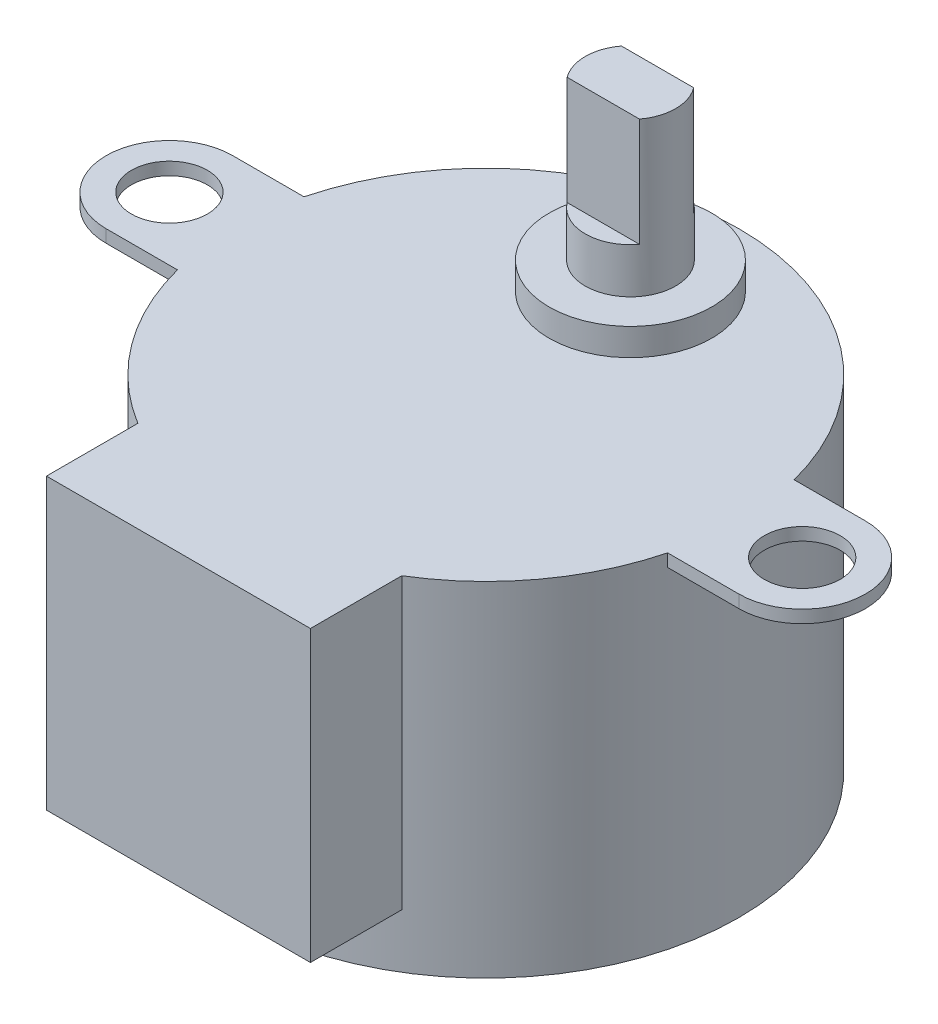
ISO-10303-21;
HEADER;
FILE_DESCRIPTION(('STEP AP214'),'2;1');
FILE_NAME('part.step','',(''),(''),'','','');
FILE_SCHEMA(('AUTOMOTIVE_DESIGN { 1 0 10303 214 1 1 1 1 }'));
ENDSEC;
DATA;
#1=APPLICATION_CONTEXT('core data for automotive mechanical design processes');
#2=APPLICATION_PROTOCOL_DEFINITION('international standard','automotive_design',2000,#1);
#3=PRODUCT_CONTEXT('',#1,'mechanical');
#4=PRODUCT('Part','Part','',(#3));
#5=PRODUCT_RELATED_PRODUCT_CATEGORY('part','',(#4));
#6=PRODUCT_DEFINITION_FORMATION('','',#4);
#7=PRODUCT_DEFINITION_CONTEXT('part definition',#1,'design');
#8=PRODUCT_DEFINITION('design','',#6,#7);
#9=PRODUCT_DEFINITION_SHAPE('','',#8);
#10=(LENGTH_UNIT() NAMED_UNIT(*) SI_UNIT(.MILLI.,.METRE.));
#11=(NAMED_UNIT(*) PLANE_ANGLE_UNIT() SI_UNIT($,.RADIAN.));
#12=(NAMED_UNIT(*) SI_UNIT($,.STERADIAN.) SOLID_ANGLE_UNIT());
#13=UNCERTAINTY_MEASURE_WITH_UNIT(LENGTH_MEASURE(1.E-05),#10,'distance_accuracy_value','');
#14=(GEOMETRIC_REPRESENTATION_CONTEXT(3) GLOBAL_UNCERTAINTY_ASSIGNED_CONTEXT((#13)) GLOBAL_UNIT_ASSIGNED_CONTEXT((#10,
#11,#12)) REPRESENTATION_CONTEXT('',''));
#15=CARTESIAN_POINT('',(0.,0.,0.));
#16=DIRECTION('',(0.,0.,1.));
#17=DIRECTION('',(1.,0.,0.));
#18=AXIS2_PLACEMENT_3D('',#15,#16,#17);
#19=CARTESIAN_POINT('',(0.,19.,0.));
#20=DIRECTION('',(0.,-1.,0.));
#21=DIRECTION('',(0.,0.,-1.));
#22=AXIS2_PLACEMENT_3D('',#19,#20,#21);
#23=CYLINDRICAL_SURFACE('',#22,14.);
#24=CARTESIAN_POINT('',(0.,19.,0.));
#25=DIRECTION('',(0.,1.,0.));
#26=DIRECTION('',(0.,0.,1.));
#27=AXIS2_PLACEMENT_3D('',#24,#25,#26);
#28=CIRCLE('',#27,14.);
#29=CARTESIAN_POINT('',(7.3,19.,11.9461290801665));
#30=VERTEX_POINT('',#29);
#31=CARTESIAN_POINT('',(13.555441711726,19.,3.5));
#32=VERTEX_POINT('',#31);
#33=EDGE_CURVE('E291',#30,#32,#28,.T.);
#34=ORIENTED_EDGE('',*,*,#33,.F.);
#35=DIRECTION('',(0.,1.,0.));
#36=VECTOR('',#35,1.);
#37=CARTESIAN_POINT('',(7.3,3.,11.9461290801665));
#38=LINE('',#37,#36);
#39=CARTESIAN_POINT('',(7.3,3.,11.9461290801665));
#40=VERTEX_POINT('',#39);
#41=EDGE_CURVE('E212',#40,#30,#38,.T.);
#42=ORIENTED_EDGE('',*,*,#41,.F.);
#43=CARTESIAN_POINT('',(0.,3.,0.));
#44=DIRECTION('',(0.,-1.,0.));
#45=DIRECTION('',(0.,0.,1.));
#46=AXIS2_PLACEMENT_3D('',#43,#44,#45);
#47=CIRCLE('',#46,14.);
#48=CARTESIAN_POINT('',(-7.3,3.,11.9461290801665));
#49=VERTEX_POINT('',#48);
#50=EDGE_CURVE('E192',#40,#49,#47,.T.);
#51=ORIENTED_EDGE('',*,*,#50,.T.);
#52=DIRECTION('',(0.,1.,0.));
#53=VECTOR('',#52,1.);
#54=CARTESIAN_POINT('',(-7.3,3.,11.9461290801665));
#55=LINE('',#54,#53);
#56=CARTESIAN_POINT('',(-7.3,19.,11.9461290801665));
#57=VERTEX_POINT('',#56);
#58=EDGE_CURVE('E205',#49,#57,#55,.T.);
#59=ORIENTED_EDGE('',*,*,#58,.T.);
#60=CARTESIAN_POINT('',(-13.555441711726,19.,3.5));
#61=VERTEX_POINT('',#60);
#62=EDGE_CURVE('E290',#61,#57,#28,.T.);
#63=ORIENTED_EDGE('',*,*,#62,.F.);
#64=DIRECTION('',(0.,1.,0.));
#65=VECTOR('',#64,1.);
#66=CARTESIAN_POINT('',(-13.555441711726,18.3,3.5));
#67=LINE('',#66,#65);
#68=CARTESIAN_POINT('',(-13.555441711726,18.3,3.5));
#69=VERTEX_POINT('',#68);
#70=EDGE_CURVE('E252',#69,#61,#67,.T.);
#71=ORIENTED_EDGE('',*,*,#70,.F.);
#72=CARTESIAN_POINT('',(0.,18.3,0.));
#73=DIRECTION('',(0.,1.,0.));
#74=DIRECTION('',(0.,0.,1.));
#75=AXIS2_PLACEMENT_3D('',#72,#73,#74);
#76=CIRCLE('',#75,14.);
#77=CARTESIAN_POINT('',(-13.555441711726,18.3,-3.5));
#78=VERTEX_POINT('',#77);
#79=EDGE_CURVE('E229',#78,#69,#76,.T.);
#80=ORIENTED_EDGE('',*,*,#79,.F.);
#81=DIRECTION('',(0.,1.,0.));
#82=VECTOR('',#81,1.);
#83=CARTESIAN_POINT('',(-13.555441711726,18.3,-3.5));
#84=LINE('',#83,#82);
#85=CARTESIAN_POINT('',(-13.555441711726,19.,-3.5));
#86=VERTEX_POINT('',#85);
#87=EDGE_CURVE('E249',#78,#86,#84,.T.);
#88=ORIENTED_EDGE('',*,*,#87,.T.);
#89=CARTESIAN_POINT('',(13.555441711726,19.,-3.5));
#90=VERTEX_POINT('',#89);
#91=EDGE_CURVE('E44',#90,#86,#28,.T.);
#92=ORIENTED_EDGE('',*,*,#91,.F.);
#93=DIRECTION('',(0.,1.,0.));
#94=VECTOR('',#93,1.);
#95=CARTESIAN_POINT('',(13.555441711726,18.3,-3.5));
#96=LINE('',#95,#94);
#97=CARTESIAN_POINT('',(13.555441711726,18.3,-3.5));
#98=VERTEX_POINT('',#97);
#99=EDGE_CURVE('E285',#98,#90,#96,.T.);
#100=ORIENTED_EDGE('',*,*,#99,.F.);
#101=CARTESIAN_POINT('',(0.,18.3,0.));
#102=DIRECTION('',(0.,1.,0.));
#103=DIRECTION('',(0.,0.,1.));
#104=AXIS2_PLACEMENT_3D('',#101,#102,#103);
#105=CIRCLE('',#104,14.);
#106=CARTESIAN_POINT('',(13.555441711726,18.3,3.5));
#107=VERTEX_POINT('',#106);
#108=EDGE_CURVE('E268',#107,#98,#105,.T.);
#109=ORIENTED_EDGE('',*,*,#108,.F.);
#110=DIRECTION('',(0.,1.,0.));
#111=VECTOR('',#110,1.);
#112=CARTESIAN_POINT('',(13.555441711726,18.3,3.5));
#113=LINE('',#112,#111);
#114=EDGE_CURVE('E282',#107,#32,#113,.T.);
#115=ORIENTED_EDGE('',*,*,#114,.T.);
#116=EDGE_LOOP('',(#34,#42,#51,#59,#63,#71,#80,#88,#92,#100,#109,#115));
#117=FACE_BOUND('',#116,.T.);
#118=CARTESIAN_POINT('',(0.,0.,0.));
#119=DIRECTION('',(0.,1.,0.));
#120=DIRECTION('',(0.,0.,1.));
#121=AXIS2_PLACEMENT_3D('',#118,#119,#120);
#122=CIRCLE('',#121,14.);
#123=CARTESIAN_POINT('',(0.,0.,14.));
#124=VERTEX_POINT('',#123);
#125=EDGE_CURVE('E39',#124,#124,#122,.T.);
#126=ORIENTED_EDGE('',*,*,#125,.T.);
#127=EDGE_LOOP('',(#126));
#128=FACE_BOUND('',#127,.T.);
#129=ADVANCED_FACE('F36',(#117,#128),#23,.T.);
#130=CARTESIAN_POINT('',(0.,19.,0.));
#131=DIRECTION('',(0.,1.,0.));
#132=DIRECTION('',(0.,0.,1.));
#133=AXIS2_PLACEMENT_3D('',#130,#131,#132);
#134=PLANE('',#133);
#135=CARTESIAN_POINT('',(0.,19.,-8.));
#136=DIRECTION('',(0.,1.,0.));
#137=DIRECTION('',(0.,0.,1.));
#138=AXIS2_PLACEMENT_3D('',#135,#136,#137);
#139=CIRCLE('',#138,4.5);
#140=CARTESIAN_POINT('',(0.,19.,-3.5));
#141=VERTEX_POINT('',#140);
#142=EDGE_CURVE('E184',#141,#141,#139,.T.);
#143=ORIENTED_EDGE('',*,*,#142,.F.);
#144=EDGE_LOOP('',(#143));
#145=FACE_BOUND('',#144,.T.);
#146=ORIENTED_EDGE('',*,*,#91,.T.);
#147=DIRECTION('',(1.,0.,0.));
#148=VECTOR('',#147,1.);
#149=CARTESIAN_POINT('',(0.,19.,-3.5));
#150=LINE('',#149,#148);
#151=CARTESIAN_POINT('',(-17.5,19.,-3.5));
#152=VERTEX_POINT('',#151);
#153=EDGE_CURVE('E241',#152,#86,#150,.T.);
#154=ORIENTED_EDGE('',*,*,#153,.F.);
#155=CARTESIAN_POINT('',(-17.5,19.,0.));
#156=DIRECTION('',(0.,1.,0.));
#157=DIRECTION('',(0.,0.,1.));
#158=AXIS2_PLACEMENT_3D('',#155,#156,#157);
#159=CIRCLE('',#158,3.5);
#160=CARTESIAN_POINT('',(-17.5,19.,3.5));
#161=VERTEX_POINT('',#160);
#162=EDGE_CURVE('E215',#161,#152,#159,.F.);
#163=ORIENTED_EDGE('',*,*,#162,.F.);
#164=DIRECTION('',(1.,0.,0.));
#165=VECTOR('',#164,1.);
#166=CARTESIAN_POINT('',(0.,19.,3.5));
#167=LINE('',#166,#165);
#168=EDGE_CURVE('E239',#161,#61,#167,.T.);
#169=ORIENTED_EDGE('',*,*,#168,.T.);
#170=ORIENTED_EDGE('',*,*,#62,.T.);
#171=DIRECTION('',(0.,0.,1.));
#172=VECTOR('',#171,1.);
#173=CARTESIAN_POINT('',(-7.3,19.,11.9461290801665));
#174=LINE('',#173,#172);
#175=CARTESIAN_POINT('',(-7.3,19.,17.));
#176=VERTEX_POINT('',#175);
#177=EDGE_CURVE('E189',#57,#176,#174,.T.);
#178=ORIENTED_EDGE('',*,*,#177,.T.);
#179=DIRECTION('',(1.,0.,0.));
#180=VECTOR('',#179,1.);
#181=CARTESIAN_POINT('',(-7.3,19.,17.));
#182=LINE('',#181,#180);
#183=CARTESIAN_POINT('',(7.3,19.,17.));
#184=VERTEX_POINT('',#183);
#185=EDGE_CURVE('E208',#176,#184,#182,.T.);
#186=ORIENTED_EDGE('',*,*,#185,.T.);
#187=DIRECTION('',(0.,0.,-1.));
#188=VECTOR('',#187,1.);
#189=CARTESIAN_POINT('',(7.3,19.,11.9461290801665));
#190=LINE('',#189,#188);
#191=EDGE_CURVE('E196',#184,#30,#190,.T.);
#192=ORIENTED_EDGE('',*,*,#191,.T.);
#193=ORIENTED_EDGE('',*,*,#33,.T.);
#194=DIRECTION('',(1.,0.,0.));
#195=VECTOR('',#194,1.);
#196=CARTESIAN_POINT('',(0.,19.,3.5));
#197=LINE('',#196,#195);
#198=CARTESIAN_POINT('',(17.5,19.,3.5));
#199=VERTEX_POINT('',#198);
#200=EDGE_CURVE('E274',#32,#199,#197,.T.);
#201=ORIENTED_EDGE('',*,*,#200,.T.);
#202=CARTESIAN_POINT('',(17.5,19.,0.));
#203=DIRECTION('',(0.,1.,0.));
#204=DIRECTION('',(0.,0.,1.));
#205=AXIS2_PLACEMENT_3D('',#202,#203,#204);
#206=CIRCLE('',#205,3.5);
#207=CARTESIAN_POINT('',(17.5,19.,-3.5));
#208=VERTEX_POINT('',#207);
#209=EDGE_CURVE('E277',#199,#208,#206,.T.);
#210=ORIENTED_EDGE('',*,*,#209,.T.);
#211=DIRECTION('',(1.,0.,0.));
#212=VECTOR('',#211,1.);
#213=CARTESIAN_POINT('',(0.,19.,-3.5));
#214=LINE('',#213,#212);
#215=EDGE_CURVE('E260',#90,#208,#214,.T.);
#216=ORIENTED_EDGE('',*,*,#215,.F.);
#217=EDGE_LOOP('',(#146,#154,#163,#169,#170,#178,#186,#192,#193,#201,#210,#216));
#218=FACE_BOUND('',#217,.T.);
#219=CARTESIAN_POINT('',(17.5,19.,0.));
#220=DIRECTION('',(0.,1.,0.));
#221=DIRECTION('',(0.,0.,1.));
#222=AXIS2_PLACEMENT_3D('',#219,#220,#221);
#223=CIRCLE('',#222,2.1);
#224=CARTESIAN_POINT('',(17.5,19.,2.1));
#225=VERTEX_POINT('',#224);
#226=EDGE_CURVE('E248',#225,#225,#223,.T.);
#227=ORIENTED_EDGE('',*,*,#226,.F.);
#228=EDGE_LOOP('',(#227));
#229=FACE_BOUND('',#228,.T.);
#230=CARTESIAN_POINT('',(-17.5,19.,0.));
#231=DIRECTION('',(0.,1.,0.));
#232=DIRECTION('',(0.,0.,1.));
#233=AXIS2_PLACEMENT_3D('',#230,#231,#232);
#234=CIRCLE('',#233,2.1);
#235=CARTESIAN_POINT('',(-17.5,19.,2.1));
#236=VERTEX_POINT('',#235);
#237=EDGE_CURVE('E226',#236,#236,#234,.F.);
#238=ORIENTED_EDGE('',*,*,#237,.T.);
#239=EDGE_LOOP('',(#238));
#240=FACE_BOUND('',#239,.T.);
#241=ADVANCED_FACE('F305',(#145,#218,#229,#240),#134,.T.);
#242=CARTESIAN_POINT('',(0.,0.,0.));
#243=DIRECTION('',(0.,1.,0.));
#244=DIRECTION('',(0.,0.,1.));
#245=AXIS2_PLACEMENT_3D('',#242,#243,#244);
#246=PLANE('',#245);
#247=ORIENTED_EDGE('',*,*,#125,.F.);
#248=EDGE_LOOP('',(#247));
#249=FACE_BOUND('',#248,.T.);
#250=ADVANCED_FACE('F302',(#249),#246,.F.);
#251=CARTESIAN_POINT('',(0.,18.3,3.5));
#252=DIRECTION('',(0.,0.,1.));
#253=DIRECTION('',(1.,0.,0.));
#254=AXIS2_PLACEMENT_3D('',#251,#252,#253);
#255=PLANE('',#254);
#256=ORIENTED_EDGE('',*,*,#200,.F.);
#257=ORIENTED_EDGE('',*,*,#114,.F.);
#258=DIRECTION('',(1.,0.,0.));
#259=VECTOR('',#258,1.);
#260=CARTESIAN_POINT('',(0.,18.3,3.5));
#261=LINE('',#260,#259);
#262=CARTESIAN_POINT('',(17.5,18.3,3.5));
#263=VERTEX_POINT('',#262);
#264=EDGE_CURVE('E259',#107,#263,#261,.T.);
#265=ORIENTED_EDGE('',*,*,#264,.T.);
#266=DIRECTION('',(0.,1.,0.));
#267=VECTOR('',#266,1.);
#268=CARTESIAN_POINT('',(17.5,18.3,3.5));
#269=LINE('',#268,#267);
#270=EDGE_CURVE('E271',#263,#199,#269,.T.);
#271=ORIENTED_EDGE('',*,*,#270,.T.);
#272=EDGE_LOOP('',(#256,#257,#265,#271));
#273=FACE_BOUND('',#272,.T.);
#274=ADVANCED_FACE('F304',(#273),#255,.T.);
#275=CARTESIAN_POINT('',(0.,18.3,-3.5));
#276=DIRECTION('',(0.,0.,1.));
#277=DIRECTION('',(1.,0.,0.));
#278=AXIS2_PLACEMENT_3D('',#275,#276,#277);
#279=PLANE('',#278);
#280=ORIENTED_EDGE('',*,*,#215,.T.);
#281=DIRECTION('',(0.,1.,0.));
#282=VECTOR('',#281,1.);
#283=CARTESIAN_POINT('',(17.5,18.3,-3.5));
#284=LINE('',#283,#282);
#285=CARTESIAN_POINT('',(17.5,18.3,-3.5));
#286=VERTEX_POINT('',#285);
#287=EDGE_CURVE('E287',#286,#208,#284,.T.);
#288=ORIENTED_EDGE('',*,*,#287,.F.);
#289=DIRECTION('',(1.,0.,0.));
#290=VECTOR('',#289,1.);
#291=CARTESIAN_POINT('',(0.,18.3,-3.5));
#292=LINE('',#291,#290);
#293=EDGE_CURVE('E266',#98,#286,#292,.T.);
#294=ORIENTED_EDGE('',*,*,#293,.F.);
#295=ORIENTED_EDGE('',*,*,#99,.T.);
#296=EDGE_LOOP('',(#280,#288,#294,#295));
#297=FACE_BOUND('',#296,.T.);
#298=ADVANCED_FACE('F310',(#297),#279,.F.);
#299=CARTESIAN_POINT('',(17.5,18.3,0.));
#300=DIRECTION('',(0.,1.,0.));
#301=DIRECTION('',(0.,0.,1.));
#302=AXIS2_PLACEMENT_3D('',#299,#300,#301);
#303=CYLINDRICAL_SURFACE('',#302,2.1);
#304=CARTESIAN_POINT('',(17.5,18.3,0.));
#305=DIRECTION('',(0.,1.,0.));
#306=DIRECTION('',(0.,0.,1.));
#307=AXIS2_PLACEMENT_3D('',#304,#305,#306);
#308=CIRCLE('',#307,2.1);
#309=CARTESIAN_POINT('',(17.5,18.3,2.1));
#310=VERTEX_POINT('',#309);
#311=EDGE_CURVE('E256',#310,#310,#308,.T.);
#312=ORIENTED_EDGE('',*,*,#311,.F.);
#313=EDGE_LOOP('',(#312));
#314=FACE_BOUND('',#313,.T.);
#315=ORIENTED_EDGE('',*,*,#226,.T.);
#316=EDGE_LOOP('',(#315));
#317=FACE_BOUND('',#316,.T.);
#318=ADVANCED_FACE('F365',(#314,#317),#303,.F.);
#319=CARTESIAN_POINT('',(17.5,18.3,0.));
#320=DIRECTION('',(0.,1.,0.));
#321=DIRECTION('',(0.,0.,1.));
#322=AXIS2_PLACEMENT_3D('',#319,#320,#321);
#323=CYLINDRICAL_SURFACE('',#322,3.5);
#324=ORIENTED_EDGE('',*,*,#209,.F.);
#325=ORIENTED_EDGE('',*,*,#270,.F.);
#326=CARTESIAN_POINT('',(17.5,18.3,0.));
#327=DIRECTION('',(0.,1.,0.));
#328=DIRECTION('',(0.,0.,1.));
#329=AXIS2_PLACEMENT_3D('',#326,#327,#328);
#330=CIRCLE('',#329,3.5);
#331=EDGE_CURVE('E263',#263,#286,#330,.T.);
#332=ORIENTED_EDGE('',*,*,#331,.T.);
#333=ORIENTED_EDGE('',*,*,#287,.T.);
#334=EDGE_LOOP('',(#324,#325,#332,#333));
#335=FACE_BOUND('',#334,.T.);
#336=ADVANCED_FACE('F329',(#335),#323,.T.);
#337=CARTESIAN_POINT('',(0.,18.3,0.));
#338=DIRECTION('',(0.,1.,0.));
#339=DIRECTION('',(0.,0.,1.));
#340=AXIS2_PLACEMENT_3D('',#337,#338,#339);
#341=PLANE('',#340);
#342=ORIENTED_EDGE('',*,*,#311,.T.);
#343=EDGE_LOOP('',(#342));
#344=FACE_BOUND('',#343,.T.);
#345=ORIENTED_EDGE('',*,*,#264,.F.);
#346=ORIENTED_EDGE('',*,*,#108,.T.);
#347=ORIENTED_EDGE('',*,*,#293,.T.);
#348=ORIENTED_EDGE('',*,*,#331,.F.);
#349=EDGE_LOOP('',(#345,#346,#347,#348));
#350=FACE_BOUND('',#349,.T.);
#351=ADVANCED_FACE('F325',(#344,#350),#341,.F.);
#352=CARTESIAN_POINT('',(-17.5,18.3,0.));
#353=DIRECTION('',(0.,1.,0.));
#354=DIRECTION('',(0.,0.,1.));
#355=AXIS2_PLACEMENT_3D('',#352,#353,#354);
#356=CYLINDRICAL_SURFACE('',#355,3.5);
#357=ORIENTED_EDGE('',*,*,#162,.T.);
#358=DIRECTION('',(0.,1.,0.));
#359=VECTOR('',#358,1.);
#360=CARTESIAN_POINT('',(-17.5,18.3,-3.5));
#361=LINE('',#360,#359);
#362=CARTESIAN_POINT('',(-17.5,18.3,-3.5));
#363=VERTEX_POINT('',#362);
#364=EDGE_CURVE('E245',#363,#152,#361,.T.);
#365=ORIENTED_EDGE('',*,*,#364,.F.);
#366=CARTESIAN_POINT('',(-17.5,18.3,0.));
#367=DIRECTION('',(0.,1.,0.));
#368=DIRECTION('',(0.,0.,1.));
#369=AXIS2_PLACEMENT_3D('',#366,#367,#368);
#370=CIRCLE('',#369,3.5);
#371=CARTESIAN_POINT('',(-17.5,18.3,3.5));
#372=VERTEX_POINT('',#371);
#373=EDGE_CURVE('E222',#372,#363,#370,.F.);
#374=ORIENTED_EDGE('',*,*,#373,.F.);
#375=DIRECTION('',(0.,1.,0.));
#376=VECTOR('',#375,1.);
#377=CARTESIAN_POINT('',(-17.5,18.3,3.5));
#378=LINE('',#377,#376);
#379=EDGE_CURVE('E236',#372,#161,#378,.T.);
#380=ORIENTED_EDGE('',*,*,#379,.T.);
#381=EDGE_LOOP('',(#357,#365,#374,#380));
#382=FACE_BOUND('',#381,.T.);
#383=ADVANCED_FACE('F354',(#382),#356,.T.);
#384=CARTESIAN_POINT('',(0.,18.3,-3.5));
#385=DIRECTION('',(0.,0.,1.));
#386=DIRECTION('',(1.,0.,0.));
#387=AXIS2_PLACEMENT_3D('',#384,#385,#386);
#388=PLANE('',#387);
#389=ORIENTED_EDGE('',*,*,#153,.T.);
#390=ORIENTED_EDGE('',*,*,#87,.F.);
#391=DIRECTION('',(1.,0.,0.));
#392=VECTOR('',#391,1.);
#393=CARTESIAN_POINT('',(0.,18.3,-3.5));
#394=LINE('',#393,#392);
#395=EDGE_CURVE('E231',#363,#78,#394,.T.);
#396=ORIENTED_EDGE('',*,*,#395,.F.);
#397=ORIENTED_EDGE('',*,*,#364,.T.);
#398=EDGE_LOOP('',(#389,#390,#396,#397));
#399=FACE_BOUND('',#398,.T.);
#400=ADVANCED_FACE('F348',(#399),#388,.F.);
#401=CARTESIAN_POINT('',(0.,18.3,3.5));
#402=DIRECTION('',(0.,0.,1.));
#403=DIRECTION('',(1.,0.,0.));
#404=AXIS2_PLACEMENT_3D('',#401,#402,#403);
#405=PLANE('',#404);
#406=ORIENTED_EDGE('',*,*,#168,.F.);
#407=ORIENTED_EDGE('',*,*,#379,.F.);
#408=DIRECTION('',(1.,0.,0.));
#409=VECTOR('',#408,1.);
#410=CARTESIAN_POINT('',(0.,18.3,3.5));
#411=LINE('',#410,#409);
#412=EDGE_CURVE('E225',#372,#69,#411,.T.);
#413=ORIENTED_EDGE('',*,*,#412,.T.);
#414=ORIENTED_EDGE('',*,*,#70,.T.);
#415=EDGE_LOOP('',(#406,#407,#413,#414));
#416=FACE_BOUND('',#415,.T.);
#417=ADVANCED_FACE('F338',(#416),#405,.T.);
#418=CARTESIAN_POINT('',(-17.5,18.3,0.));
#419=DIRECTION('',(0.,1.,0.));
#420=DIRECTION('',(0.,0.,1.));
#421=AXIS2_PLACEMENT_3D('',#418,#419,#420);
#422=CYLINDRICAL_SURFACE('',#421,2.1);
#423=CARTESIAN_POINT('',(-17.5,18.3,0.));
#424=DIRECTION('',(0.,1.,0.));
#425=DIRECTION('',(0.,0.,1.));
#426=AXIS2_PLACEMENT_3D('',#423,#424,#425);
#427=CIRCLE('',#426,2.1);
#428=CARTESIAN_POINT('',(-17.5,18.3,2.1));
#429=VERTEX_POINT('',#428);
#430=EDGE_CURVE('E233',#429,#429,#427,.F.);
#431=ORIENTED_EDGE('',*,*,#430,.T.);
#432=EDGE_LOOP('',(#431));
#433=FACE_BOUND('',#432,.T.);
#434=ORIENTED_EDGE('',*,*,#237,.F.);
#435=EDGE_LOOP('',(#434));
#436=FACE_BOUND('',#435,.T.);
#437=ADVANCED_FACE('F335',(#433,#436),#422,.F.);
#438=CARTESIAN_POINT('',(0.,18.3,0.));
#439=DIRECTION('',(0.,1.,0.));
#440=DIRECTION('',(0.,0.,1.));
#441=AXIS2_PLACEMENT_3D('',#438,#439,#440);
#442=PLANE('',#441);
#443=ORIENTED_EDGE('',*,*,#373,.T.);
#444=ORIENTED_EDGE('',*,*,#395,.T.);
#445=ORIENTED_EDGE('',*,*,#79,.T.);
#446=ORIENTED_EDGE('',*,*,#412,.F.);
#447=EDGE_LOOP('',(#443,#444,#445,#446));
#448=FACE_BOUND('',#447,.T.);
#449=ORIENTED_EDGE('',*,*,#430,.F.);
#450=EDGE_LOOP('',(#449));
#451=FACE_BOUND('',#450,.T.);
#452=ADVANCED_FACE('F337',(#448,#451),#442,.F.);
#453=CARTESIAN_POINT('',(7.3,3.,11.9461290801665));
#454=DIRECTION('',(1.,0.,0.));
#455=DIRECTION('',(0.,0.,-1.));
#456=AXIS2_PLACEMENT_3D('',#453,#454,#455);
#457=PLANE('',#456);
#458=ORIENTED_EDGE('',*,*,#191,.F.);
#459=DIRECTION('',(0.,1.,0.));
#460=VECTOR('',#459,1.);
#461=CARTESIAN_POINT('',(7.3,3.,17.));
#462=LINE('',#461,#460);
#463=CARTESIAN_POINT('',(7.3,3.,17.));
#464=VERTEX_POINT('',#463);
#465=EDGE_CURVE('E216',#464,#184,#462,.T.);
#466=ORIENTED_EDGE('',*,*,#465,.F.);
#467=DIRECTION('',(0.,0.,-1.));
#468=VECTOR('',#467,1.);
#469=CARTESIAN_POINT('',(7.3,3.,11.9461290801665));
#470=LINE('',#469,#468);
#471=EDGE_CURVE('E202',#464,#40,#470,.T.);
#472=ORIENTED_EDGE('',*,*,#471,.T.);
#473=ORIENTED_EDGE('',*,*,#41,.T.);
#474=EDGE_LOOP('',(#458,#466,#472,#473));
#475=FACE_BOUND('',#474,.T.);
#476=ADVANCED_FACE('F345',(#475),#457,.T.);
#477=CARTESIAN_POINT('',(-7.3,3.,17.));
#478=DIRECTION('',(0.,0.,1.));
#479=DIRECTION('',(1.,0.,0.));
#480=AXIS2_PLACEMENT_3D('',#477,#478,#479);
#481=PLANE('',#480);
#482=ORIENTED_EDGE('',*,*,#185,.F.);
#483=DIRECTION('',(0.,1.,0.));
#484=VECTOR('',#483,1.);
#485=CARTESIAN_POINT('',(-7.3,3.,17.));
#486=LINE('',#485,#484);
#487=CARTESIAN_POINT('',(-7.3,3.,17.));
#488=VERTEX_POINT('',#487);
#489=EDGE_CURVE('E218',#488,#176,#486,.T.);
#490=ORIENTED_EDGE('',*,*,#489,.F.);
#491=DIRECTION('',(1.,0.,0.));
#492=VECTOR('',#491,1.);
#493=CARTESIAN_POINT('',(-7.3,3.,17.));
#494=LINE('',#493,#492);
#495=EDGE_CURVE('E199',#488,#464,#494,.T.);
#496=ORIENTED_EDGE('',*,*,#495,.T.);
#497=ORIENTED_EDGE('',*,*,#465,.T.);
#498=EDGE_LOOP('',(#482,#490,#496,#497));
#499=FACE_BOUND('',#498,.T.);
#500=ADVANCED_FACE('F423',(#499),#481,.T.);
#501=CARTESIAN_POINT('',(-7.3,3.,11.9461290801665));
#502=DIRECTION('',(-1.,0.,0.));
#503=DIRECTION('',(0.,0.,1.));
#504=AXIS2_PLACEMENT_3D('',#501,#502,#503);
#505=PLANE('',#504);
#506=ORIENTED_EDGE('',*,*,#177,.F.);
#507=ORIENTED_EDGE('',*,*,#58,.F.);
#508=DIRECTION('',(0.,0.,1.));
#509=VECTOR('',#508,1.);
#510=CARTESIAN_POINT('',(-7.3,3.,11.9461290801665));
#511=LINE('',#510,#509);
#512=EDGE_CURVE('E195',#49,#488,#511,.T.);
#513=ORIENTED_EDGE('',*,*,#512,.T.);
#514=ORIENTED_EDGE('',*,*,#489,.T.);
#515=EDGE_LOOP('',(#506,#507,#513,#514));
#516=FACE_BOUND('',#515,.T.);
#517=ADVANCED_FACE('F433',(#516),#505,.T.);
#518=CARTESIAN_POINT('',(0.,3.,0.));
#519=DIRECTION('',(0.,1.,0.));
#520=DIRECTION('',(0.,0.,1.));
#521=AXIS2_PLACEMENT_3D('',#518,#519,#520);
#522=PLANE('',#521);
#523=ORIENTED_EDGE('',*,*,#50,.F.);
#524=ORIENTED_EDGE('',*,*,#471,.F.);
#525=ORIENTED_EDGE('',*,*,#495,.F.);
#526=ORIENTED_EDGE('',*,*,#512,.F.);
#527=EDGE_LOOP('',(#523,#524,#525,#526));
#528=FACE_BOUND('',#527,.T.);
#529=ADVANCED_FACE('F443',(#528),#522,.F.);
#530=CARTESIAN_POINT('',(0.,20.5,-8.));
#531=DIRECTION('',(0.,-1.,0.));
#532=DIRECTION('',(0.,0.,-1.));
#533=AXIS2_PLACEMENT_3D('',#530,#531,#532);
#534=CYLINDRICAL_SURFACE('',#533,4.5);
#535=CARTESIAN_POINT('',(0.,20.5,-8.));
#536=DIRECTION('',(0.,1.,0.));
#537=DIRECTION('',(0.,0.,1.));
#538=AXIS2_PLACEMENT_3D('',#535,#536,#537);
#539=CIRCLE('',#538,4.5);
#540=CARTESIAN_POINT('',(0.,20.5,-3.5));
#541=VERTEX_POINT('',#540);
#542=EDGE_CURVE('E186',#541,#541,#539,.T.);
#543=ORIENTED_EDGE('',*,*,#542,.F.);
#544=EDGE_LOOP('',(#543));
#545=FACE_BOUND('',#544,.T.);
#546=ORIENTED_EDGE('',*,*,#142,.T.);
#547=EDGE_LOOP('',(#546));
#548=FACE_BOUND('',#547,.T.);
#549=ADVANCED_FACE('F452',(#545,#548),#534,.T.);
#550=CARTESIAN_POINT('',(0.,20.5,-8.));
#551=DIRECTION('',(0.,1.,0.));
#552=DIRECTION('',(0.,0.,1.));
#553=AXIS2_PLACEMENT_3D('',#550,#551,#552);
#554=PLANE('',#553);
#555=CARTESIAN_POINT('',(0.,20.5,-8.));
#556=DIRECTION('',(0.,1.,0.));
#557=DIRECTION('',(0.,0.,1.));
#558=AXIS2_PLACEMENT_3D('',#555,#556,#557);
#559=CIRCLE('',#558,2.5);
#560=CARTESIAN_POINT('',(0.,20.5,-5.5));
#561=VERTEX_POINT('',#560);
#562=EDGE_CURVE('E11',#561,#561,#559,.T.);
#563=ORIENTED_EDGE('',*,*,#562,.F.);
#564=EDGE_LOOP('',(#563));
#565=FACE_BOUND('',#564,.T.);
#566=ORIENTED_EDGE('',*,*,#542,.T.);
#567=EDGE_LOOP('',(#566));
#568=FACE_BOUND('',#567,.T.);
#569=ADVANCED_FACE('F468',(#565,#568),#554,.T.);
#570=CARTESIAN_POINT('',(0.,29.,-8.));
#571=DIRECTION('',(0.,-1.,0.));
#572=DIRECTION('',(0.,0.,-1.));
#573=AXIS2_PLACEMENT_3D('',#570,#571,#572);
#574=CYLINDRICAL_SURFACE('',#573,2.5);
#575=CARTESIAN_POINT('',(0.,29.,-8.));
#576=DIRECTION('',(0.,1.,0.));
#577=DIRECTION('',(0.,0.,1.));
#578=AXIS2_PLACEMENT_3D('',#575,#576,#577);
#579=CIRCLE('',#578,2.5);
#580=CARTESIAN_POINT('',(-2.,29.,-9.5));
#581=VERTEX_POINT('',#580);
#582=CARTESIAN_POINT('',(-2.,29.,-6.5));
#583=VERTEX_POINT('',#582);
#584=EDGE_CURVE('E167',#581,#583,#579,.T.);
#585=ORIENTED_EDGE('',*,*,#584,.F.);
#586=DIRECTION('',(0.,1.,0.));
#587=VECTOR('',#586,1.);
#588=CARTESIAN_POINT('',(-2.,23.,-9.5));
#589=LINE('',#588,#587);
#590=CARTESIAN_POINT('',(-2.,23.,-9.5));
#591=VERTEX_POINT('',#590);
#592=EDGE_CURVE('E52',#591,#581,#589,.T.);
#593=ORIENTED_EDGE('',*,*,#592,.F.);
#594=CARTESIAN_POINT('',(0.,23.,-8.));
#595=DIRECTION('',(0.,1.,0.));
#596=DIRECTION('',(0.,0.,1.));
#597=AXIS2_PLACEMENT_3D('',#594,#595,#596);
#598=CIRCLE('',#597,2.5);
#599=CARTESIAN_POINT('',(2.,23.,-9.5));
#600=VERTEX_POINT('',#599);
#601=EDGE_CURVE('E152',#600,#591,#598,.T.);
#602=ORIENTED_EDGE('',*,*,#601,.F.);
#603=DIRECTION('',(0.,1.,0.));
#604=VECTOR('',#603,1.);
#605=CARTESIAN_POINT('',(2.,23.,-9.5));
#606=LINE('',#605,#604);
#607=CARTESIAN_POINT('',(2.,29.,-9.5));
#608=VERTEX_POINT('',#607);
#609=EDGE_CURVE('E160',#600,#608,#606,.T.);
#610=ORIENTED_EDGE('',*,*,#609,.T.);
#611=CARTESIAN_POINT('',(2.,29.,-6.5));
#612=VERTEX_POINT('',#611);
#613=EDGE_CURVE('E182',#612,#608,#579,.T.);
#614=ORIENTED_EDGE('',*,*,#613,.F.);
#615=DIRECTION('',(0.,1.,0.));
#616=VECTOR('',#615,1.);
#617=CARTESIAN_POINT('',(2.,23.,-6.5));
#618=LINE('',#617,#616);
#619=CARTESIAN_POINT('',(2.,23.,-6.5));
#620=VERTEX_POINT('',#619);
#621=EDGE_CURVE('E60',#620,#612,#618,.T.);
#622=ORIENTED_EDGE('',*,*,#621,.F.);
#623=CARTESIAN_POINT('',(0.,23.,-8.));
#624=DIRECTION('',(0.,1.,0.));
#625=DIRECTION('',(0.,0.,1.));
#626=AXIS2_PLACEMENT_3D('',#623,#624,#625);
#627=CIRCLE('',#626,2.5);
#628=CARTESIAN_POINT('',(-2.,23.,-6.5));
#629=VERTEX_POINT('',#628);
#630=EDGE_CURVE('E172',#629,#620,#627,.T.);
#631=ORIENTED_EDGE('',*,*,#630,.F.);
#632=DIRECTION('',(0.,1.,0.));
#633=VECTOR('',#632,1.);
#634=CARTESIAN_POINT('',(-2.,23.,-6.5));
#635=LINE('',#634,#633);
#636=EDGE_CURVE('E179',#629,#583,#635,.T.);
#637=ORIENTED_EDGE('',*,*,#636,.T.);
#638=EDGE_LOOP('',(#585,#593,#602,#610,#614,#622,#631,#637));
#639=FACE_BOUND('',#638,.T.);
#640=ORIENTED_EDGE('',*,*,#562,.T.);
#641=EDGE_LOOP('',(#640));
#642=FACE_BOUND('',#641,.T.);
#643=ADVANCED_FACE('F163',(#639,#642),#574,.T.);
#644=CARTESIAN_POINT('',(0.,29.,-8.));
#645=DIRECTION('',(0.,1.,0.));
#646=DIRECTION('',(0.,0.,1.));
#647=AXIS2_PLACEMENT_3D('',#644,#645,#646);
#648=PLANE('',#647);
#649=DIRECTION('',(1.,0.,0.));
#650=VECTOR('',#649,1.);
#651=CARTESIAN_POINT('',(-2.,29.,-9.5));
#652=LINE('',#651,#650);
#653=EDGE_CURVE('E157',#581,#608,#652,.T.);
#654=ORIENTED_EDGE('',*,*,#653,.F.);
#655=ORIENTED_EDGE('',*,*,#584,.T.);
#656=DIRECTION('',(-1.,0.,0.));
#657=VECTOR('',#656,1.);
#658=CARTESIAN_POINT('',(-2.,29.,-6.5));
#659=LINE('',#658,#657);
#660=EDGE_CURVE('E175',#612,#583,#659,.T.);
#661=ORIENTED_EDGE('',*,*,#660,.F.);
#662=ORIENTED_EDGE('',*,*,#613,.T.);
#663=EDGE_LOOP('',(#654,#655,#661,#662));
#664=FACE_BOUND('',#663,.T.);
#665=ADVANCED_FACE('F487',(#664),#648,.T.);
#666=CARTESIAN_POINT('',(-2.,23.,-6.5));
#667=DIRECTION('',(0.,0.,-1.));
#668=DIRECTION('',(-1.,0.,0.));
#669=AXIS2_PLACEMENT_3D('',#666,#667,#668);
#670=PLANE('',#669);
#671=ORIENTED_EDGE('',*,*,#660,.T.);
#672=ORIENTED_EDGE('',*,*,#636,.F.);
#673=DIRECTION('',(-1.,0.,0.));
#674=VECTOR('',#673,1.);
#675=CARTESIAN_POINT('',(-2.,23.,-6.5));
#676=LINE('',#675,#674);
#677=EDGE_CURVE('E174',#620,#629,#676,.T.);
#678=ORIENTED_EDGE('',*,*,#677,.F.);
#679=ORIENTED_EDGE('',*,*,#621,.T.);
#680=EDGE_LOOP('',(#671,#672,#678,#679));
#681=FACE_BOUND('',#680,.T.);
#682=ADVANCED_FACE('F496',(#681),#670,.F.);
#683=CARTESIAN_POINT('',(0.,23.,-8.));
#684=DIRECTION('',(0.,1.,0.));
#685=DIRECTION('',(0.,0.,1.));
#686=AXIS2_PLACEMENT_3D('',#683,#684,#685);
#687=PLANE('',#686);
#688=ORIENTED_EDGE('',*,*,#630,.T.);
#689=ORIENTED_EDGE('',*,*,#677,.T.);
#690=EDGE_LOOP('',(#688,#689));
#691=FACE_BOUND('',#690,.T.);
#692=ADVANCED_FACE('F506',(#691),#687,.T.);
#693=CARTESIAN_POINT('',(-2.,23.,-9.5));
#694=DIRECTION('',(0.,0.,1.));
#695=DIRECTION('',(1.,0.,0.));
#696=AXIS2_PLACEMENT_3D('',#693,#694,#695);
#697=PLANE('',#696);
#698=ORIENTED_EDGE('',*,*,#653,.T.);
#699=ORIENTED_EDGE('',*,*,#609,.F.);
#700=DIRECTION('',(1.,0.,0.));
#701=VECTOR('',#700,1.);
#702=CARTESIAN_POINT('',(-2.,23.,-9.5));
#703=LINE('',#702,#701);
#704=EDGE_CURVE('E154',#591,#600,#703,.T.);
#705=ORIENTED_EDGE('',*,*,#704,.F.);
#706=ORIENTED_EDGE('',*,*,#592,.T.);
#707=EDGE_LOOP('',(#698,#699,#705,#706));
#708=FACE_BOUND('',#707,.T.);
#709=ADVANCED_FACE('F159',(#708),#697,.F.);
#710=CARTESIAN_POINT('',(0.,23.,-8.));
#711=DIRECTION('',(0.,1.,0.));
#712=DIRECTION('',(0.,0.,1.));
#713=AXIS2_PLACEMENT_3D('',#710,#711,#712);
#714=PLANE('',#713);
#715=ORIENTED_EDGE('',*,*,#601,.T.);
#716=ORIENTED_EDGE('',*,*,#704,.T.);
#717=EDGE_LOOP('',(#715,#716));
#718=FACE_BOUND('',#717,.T.);
#719=ADVANCED_FACE('F153',(#718),#714,.T.);
#720=CLOSED_SHELL('',(#129,#241,#250,#274,#298,#318,#336,#351,#383,#400,#417,#437,#452,#476,
#500,#517,#529,#549,#569,#643,#665,#682,#692,#709,#719));
#721=MANIFOLD_SOLID_BREP('B2',#720);
#722=ADVANCED_BREP_SHAPE_REPRESENTATION('',(#18,#721),#14);
#723=SHAPE_DEFINITION_REPRESENTATION(#9,#722);
ENDSEC;
END-ISO-10303-21;
